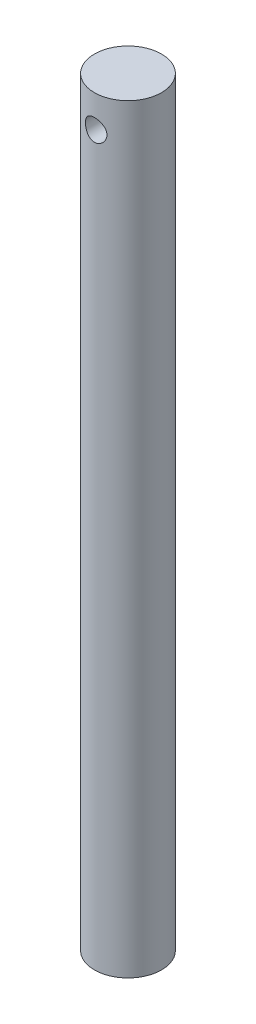
ISO-10303-21;
HEADER;
FILE_DESCRIPTION(('STEP AP214'),'2;1');
FILE_NAME('part.step','',(''),(''),'','','');
FILE_SCHEMA(('AUTOMOTIVE_DESIGN { 1 0 10303 214 1 1 1 1 }'));
ENDSEC;
DATA;
#1=APPLICATION_CONTEXT('core data for automotive mechanical design processes');
#2=APPLICATION_PROTOCOL_DEFINITION('international standard','automotive_design',2000,#1);
#3=PRODUCT_CONTEXT('',#1,'mechanical');
#4=PRODUCT('Part','Part','',(#3));
#5=PRODUCT_RELATED_PRODUCT_CATEGORY('part','',(#4));
#6=PRODUCT_DEFINITION_FORMATION('','',#4);
#7=PRODUCT_DEFINITION_CONTEXT('part definition',#1,'design');
#8=PRODUCT_DEFINITION('design','',#6,#7);
#9=PRODUCT_DEFINITION_SHAPE('','',#8);
#10=(LENGTH_UNIT() NAMED_UNIT(*) SI_UNIT(.MILLI.,.METRE.));
#11=(NAMED_UNIT(*) PLANE_ANGLE_UNIT() SI_UNIT($,.RADIAN.));
#12=(NAMED_UNIT(*) SI_UNIT($,.STERADIAN.) SOLID_ANGLE_UNIT());
#13=UNCERTAINTY_MEASURE_WITH_UNIT(LENGTH_MEASURE(1.E-05),#10,'distance_accuracy_value','');
#14=(GEOMETRIC_REPRESENTATION_CONTEXT(3) GLOBAL_UNCERTAINTY_ASSIGNED_CONTEXT((#13)) GLOBAL_UNIT_ASSIGNED_CONTEXT((#10,
#11,#12)) REPRESENTATION_CONTEXT('',''));
#15=CARTESIAN_POINT('',(0.,0.,0.));
#16=DIRECTION('',(0.,0.,1.));
#17=DIRECTION('',(1.,0.,0.));
#18=AXIS2_PLACEMENT_3D('',#15,#16,#17);
#19=CARTESIAN_POINT('',(20.574,290.957,19.939));
#20=DIRECTION('',(0.,-1.,0.));
#21=DIRECTION('',(0.,0.,1.));
#22=AXIS2_PLACEMENT_3D('',#19,#20,#21);
#23=CYLINDRICAL_SURFACE('',#22,9.906);
#24=CARTESIAN_POINT('',(20.574,284.607,29.845));
#25=CARTESIAN_POINT('',(20.4003900975091,284.606999562888,29.8449996061915));
#26=CARTESIAN_POINT('',(20.2267746019822,284.59271373406,29.8403933308697));
#27=CARTESIAN_POINT('',(19.8846347785665,284.536107084769,29.8224701738279));
#28=CARTESIAN_POINT('',(19.7161113704819,284.493781230604,29.8091517281183));
#29=CARTESIAN_POINT('',(19.3891383375286,284.382678440052,29.7752562456891));
#30=CARTESIAN_POINT('',(19.2306731118319,284.313943694529,29.7546907911152));
#31=CARTESIAN_POINT('',(18.9275180945867,284.152157998881,29.7084154733764));
#32=CARTESIAN_POINT('',(18.7828306929127,284.059102840629,29.6827047201083));
#33=CARTESIAN_POINT('',(18.5066631305322,283.848155524504,29.6279299838278));
#34=CARTESIAN_POINT('',(18.3756902580533,283.729619019658,29.5987901566408));
#35=CARTESIAN_POINT('',(18.1351014488948,283.472444978284,29.5408723692128));
#36=CARTESIAN_POINT('',(18.0254897541473,283.33380345879,29.5120944819057));
#37=CARTESIAN_POINT('',(17.8279296997844,283.035897265666,29.4573373522228));
#38=CARTESIAN_POINT('',(17.740624744777,282.876187150229,29.4314512803114));
#39=CARTESIAN_POINT('',(17.5943262770747,282.543387460439,29.3865541474673));
#40=CARTESIAN_POINT('',(17.535324864277,282.370301635202,29.3675411684781));
#41=CARTESIAN_POINT('',(17.449182282334,282.021405498296,29.3393382623613));
#42=CARTESIAN_POINT('',(17.4210964103846,281.845852582549,29.329857882216));
#43=CARTESIAN_POINT('',(17.3946299992803,281.49228999913,29.320932404975));
#44=CARTESIAN_POINT('',(17.3962410877471,281.314281038026,29.3214844794576));
#45=CARTESIAN_POINT('',(17.4283860255288,280.968763995361,29.3323058482074));
#46=CARTESIAN_POINT('',(17.4577071073125,280.801128149536,29.3421676684055));
#47=CARTESIAN_POINT('',(17.542468814693,280.473293570519,29.369833583895));
#48=CARTESIAN_POINT('',(17.5979123480243,280.31309566744,29.3876385633412));
#49=CARTESIAN_POINT('',(17.7341776934832,280.001846043877,29.4294885452327));
#50=CARTESIAN_POINT('',(17.8153721512621,279.850970183295,29.4536242115264));
#51=CARTESIAN_POINT('',(18.0005758026711,279.564592346352,29.5053758925019));
#52=CARTESIAN_POINT('',(18.1045911782425,279.429094550863,29.5329928493638));
#53=CARTESIAN_POINT('',(18.3383874139366,279.170478214256,29.5902181525973));
#54=CARTESIAN_POINT('',(18.4691658543698,279.048266850427,29.6198584357406));
#55=CARTESIAN_POINT('',(18.7497288111613,278.827283363236,29.6766243903546));
#56=CARTESIAN_POINT('',(18.8995148840282,278.728513161341,29.7037498555754));
#57=CARTESIAN_POINT('',(19.2156556946911,278.556557925074,29.7527406621395));
#58=CARTESIAN_POINT('',(19.3821413753952,278.483599313268,29.7745589522444));
#59=CARTESIAN_POINT('',(19.725886559119,278.366997824111,29.8101368137503));
#60=CARTESIAN_POINT('',(19.9031425937042,278.323345563073,29.8238989644894));
#61=CARTESIAN_POINT('',(20.2557042212796,278.26816452681,29.8413942383645));
#62=CARTESIAN_POINT('',(20.4307990071384,278.255408529173,29.8455102845543));
#63=CARTESIAN_POINT('',(20.7806516136552,278.25890848489,29.8443881106845));
#64=CARTESIAN_POINT('',(20.9554094822125,278.275159954378,29.8391513363491));
#65=CARTESIAN_POINT('',(21.2948266941627,278.33523341978,29.8201640449065));
#66=CARTESIAN_POINT('',(21.4596308313205,278.37831648951,29.8066418593152));
#67=CARTESIAN_POINT('',(21.7796180904854,278.489920177116,29.7726784506642));
#68=CARTESIAN_POINT('',(21.9348000044281,278.558443981545,29.7522363608874));
#69=CARTESIAN_POINT('',(22.2354812033595,278.72090432677,29.7058855888616));
#70=CARTESIAN_POINT('',(22.3806389165075,278.815436526499,29.6798523778661));
#71=CARTESIAN_POINT('',(22.6534378917215,279.026521354015,29.6252871712492));
#72=CARTESIAN_POINT('',(22.7810741539488,279.143080244778,29.5967544661731));
#73=CARTESIAN_POINT('',(23.0207530070436,279.400683190269,29.5389002188114));
#74=CARTESIAN_POINT('',(23.1319203126039,279.542547325863,29.5095955845007));
#75=CARTESIAN_POINT('',(23.3289606959753,279.843551670835,29.4547513522842));
#76=CARTESIAN_POINT('',(23.4148339678688,280.002691747642,29.4292117254902));
#77=CARTESIAN_POINT('',(23.5583599536811,280.333539233718,29.3850619207215));
#78=CARTESIAN_POINT('',(23.6161042500276,280.505203738166,29.3664293028914));
#79=CARTESIAN_POINT('',(23.7016398485219,280.856545356796,29.3384026591143));
#80=CARTESIAN_POINT('',(23.7294433230972,281.036219183829,29.3290048788844));
#81=CARTESIAN_POINT('',(23.7534046771126,281.389290263017,29.3209168710177));
#82=CARTESIAN_POINT('',(23.7510046935671,281.56257962913,29.3217386621516));
#83=CARTESIAN_POINT('',(23.7181343011121,281.906153212945,29.3328037727765));
#84=CARTESIAN_POINT('',(23.687665332273,282.07643758436,29.3430466089237));
#85=CARTESIAN_POINT('',(23.6005088319737,282.406441192232,29.3714500629734));
#86=CARTESIAN_POINT('',(23.5442544271075,282.566286966696,29.3894796065412));
#87=CARTESIAN_POINT('',(23.4074683392176,282.874397348048,29.4313857010331));
#88=CARTESIAN_POINT('',(23.3269315390082,283.022659505545,29.4552634841953));
#89=CARTESIAN_POINT('',(23.1400216552054,283.309954622222,29.5073924945417));
#90=CARTESIAN_POINT('',(23.0327274056325,283.448362996902,29.5357825500603));
#91=CARTESIAN_POINT('',(22.7969450135381,283.70567702225,29.5931209962115));
#92=CARTESIAN_POINT('',(22.6684510831818,283.824577329191,29.6220695374079));
#93=CARTESIAN_POINT('',(22.3885111653527,284.043675934385,29.6784786976015));
#94=CARTESIAN_POINT('',(22.2364194020823,284.143074282696,29.705851812889));
#95=CARTESIAN_POINT('',(21.9168117042693,284.314769298846,29.7548939099958));
#96=CARTESIAN_POINT('',(21.7493010735514,284.387075242929,29.776564843443));
#97=CARTESIAN_POINT('',(21.4156289154909,284.498108442957,29.8105062287362));
#98=CARTESIAN_POINT('',(21.2501828955443,284.538820324816,29.8233253822498));
#99=CARTESIAN_POINT('',(20.9144923067557,284.593263237149,29.8405715028082));
#100=CARTESIAN_POINT('',(20.7442488426637,284.60700042865,29.8450003861844));
#101=CARTESIAN_POINT('',(20.574,284.607,29.845));
#102=B_SPLINE_CURVE_WITH_KNOTS('',3,(#24,#25,#26,#27,#28,#29,#30,#31,#32,#33,#34,#35,#36,#37,
#38,#39,#40,#41,#42,#43,#44,#45,#46,#47,#48,#49,#50,#51,#52,#53,#54,#55,#56,#57,#58,#59,#60,#61,
#62,#63,#64,#65,#66,#67,#68,#69,#70,#71,#72,#73,#74,#75,#76,#77,#78,#79,#80,#81,#82,#83,#84,#85,
#86,#87,#88,#89,#90,#91,#92,#93,#94,#95,#96,#97,#98,#99,#100,#101),.UNSPECIFIED.,.T.,.F.,(4,2,2,
2,2,2,2,2,2,2,2,2,2,2,2,2,2,2,2,2,2,2,2,2,2,2,2,2,2,2,2,2,2,2,2,2,2,2,4),(0.,0.520203653190159,
1.04050071782689,1.55996998879536,2.07952920238256,2.61421803209669,3.14901293309813,
3.69783084299902,4.24649547723637,4.77788401275632,5.309122737732,5.81813774594538,
6.32720942687722,6.84401266954643,7.36095608188885,7.90272878350447,8.44454587879508,
8.99100443008418,9.53728792564177,10.0614885570786,10.5856081665447,11.0958958548675,
11.6062474803186,12.1294314627599,12.6527644295539,13.1979818527922,13.7431950924381,
14.2866211591328,14.8298262127012,15.3471971329632,15.8645415111503,16.373497501837,
16.8825608231595,17.4124232772658,17.9424306319825,18.4909828852277,19.0393471461224,
19.5495962947256,20.0597288887445),.UNSPECIFIED.);
#103=CARTESIAN_POINT('',(20.574,284.607,29.845));
#104=VERTEX_POINT('',#103);
#105=EDGE_CURVE('E37',#104,#104,#102,.T.);
#106=ORIENTED_EDGE('',*,*,#105,.F.);
#107=EDGE_LOOP('',(#106));
#108=FACE_BOUND('',#107,.T.);
#109=CARTESIAN_POINT('',(23.749,281.432,10.5555991772705));
#110=CARTESIAN_POINT('',(23.7489995390351,281.258648845424,10.555598669891));
#111=CARTESIAN_POINT('',(23.73475472324,281.085292093388,10.5507428403606));
#112=CARTESIAN_POINT('',(23.6783257570464,280.743687818861,10.531935652275));
#113=CARTESIAN_POINT('',(23.6361351975167,280.575441477662,10.5179822072666));
#114=CARTESIAN_POINT('',(23.5254275060581,280.24905768367,10.4827190522964));
#115=CARTESIAN_POINT('',(23.456958833973,280.090902244538,10.461422890448));
#116=CARTESIAN_POINT('',(23.2958016799056,279.78827622172,10.4138929944622));
#117=CARTESIAN_POINT('',(23.2031085050567,279.643808297031,10.3876583038893));
#118=CARTESIAN_POINT('',(22.9925447882256,279.367435871302,10.3321436934421));
#119=CARTESIAN_POINT('',(22.8739482742391,279.236098733427,10.3027921228796));
#120=CARTESIAN_POINT('',(22.616496293565,278.99479483814,10.2449590642021));
#121=CARTESIAN_POINT('',(22.4776378477726,278.884831228824,10.21647770478));
#122=CARTESIAN_POINT('',(22.1794994338713,278.686865608948,10.162770781909));
#123=CARTESIAN_POINT('',(22.0198104845676,278.599451735604,10.1376393759217));
#124=CARTESIAN_POINT('',(21.687053441495,278.452946469813,10.094303527544));
#125=CARTESIAN_POINT('',(21.5139886778021,278.393848054089,10.0760973676682));
#126=CARTESIAN_POINT('',(21.1653363559693,278.307556830947,10.0491706408477));
#127=CARTESIAN_POINT('',(20.9900116534782,278.279393464855,10.0401621911904));
#128=CARTESIAN_POINT('',(20.6369093181982,278.252692550356,10.0316271990831));
#129=CARTESIAN_POINT('',(20.4591322812483,278.254147927961,10.0320983925639));
#130=CARTESIAN_POINT('',(20.113017246645,278.286013338169,10.0422711662201));
#131=CARTESIAN_POINT('',(19.9445708572342,278.315370479982,10.0516370882707));
#132=CARTESIAN_POINT('',(19.6151357663183,278.40047336135,10.0781308856556));
#133=CARTESIAN_POINT('',(19.4541475599441,278.456220850147,10.0952592755098));
#134=CARTESIAN_POINT('',(19.1418175974258,278.593174871574,10.1357952456068));
#135=CARTESIAN_POINT('',(18.9906229499398,278.674693346282,10.1592792264352));
#136=CARTESIAN_POINT('',(18.7037374951982,278.860622591593,10.2100632635124));
#137=CARTESIAN_POINT('',(18.5680507753764,278.965039376449,10.2373643216344));
#138=CARTESIAN_POINT('',(18.3097596090472,279.199169584741,10.2942960196121));
#139=CARTESIAN_POINT('',(18.1879866322157,279.329789491973,10.3239763241294));
#140=CARTESIAN_POINT('',(17.967818041401,279.609865234723,10.3813000865392));
#141=CARTESIAN_POINT('',(17.8694254872229,279.759323531717,10.4089432775078));
#142=CARTESIAN_POINT('',(17.6977751670265,280.075289872861,10.4593217241486));
#143=CARTESIAN_POINT('',(17.6248414173911,280.241985004097,10.4819924356187));
#144=CARTESIAN_POINT('',(17.5083486253,280.586195456073,10.51910619941));
#145=CARTESIAN_POINT('',(17.4647783736975,280.763706619679,10.5335523910111));
#146=CARTESIAN_POINT('',(17.4098868374428,281.116510345579,10.5518795117724));
#147=CARTESIAN_POINT('',(17.3972862425618,281.291582198877,10.5561792587354));
#148=CARTESIAN_POINT('',(17.4010879812931,281.641356226441,10.5548924763253));
#149=CARTESIAN_POINT('',(17.4174855442112,281.816058456783,10.5493075731465));
#150=CARTESIAN_POINT('',(17.4776723805921,282.154510097642,10.5292958124389));
#151=CARTESIAN_POINT('',(17.5205988996103,282.318431146569,10.5151477282929));
#152=CARTESIAN_POINT('',(17.6316037877074,282.636720351873,10.4799033861806));
#153=CARTESIAN_POINT('',(17.699686397315,282.791086892536,10.4588059568377));
#154=CARTESIAN_POINT('',(17.8613868420137,283.090987774903,10.4112589135614));
#155=CARTESIAN_POINT('',(17.9557063087524,283.236120873992,10.3846683221826));
#156=CARTESIAN_POINT('',(18.1663931271625,283.508964480416,10.3294159111981));
#157=CARTESIAN_POINT('',(18.2827665005126,283.6366702129,10.3007535272279));
#158=CARTESIAN_POINT('',(18.5403356898319,283.876826024731,10.2430634746458));
#159=CARTESIAN_POINT('',(18.6823974333562,283.988359361769,10.2140750819163));
#160=CARTESIAN_POINT('',(18.983926894148,284.186048768724,10.160251455954));
#161=CARTESIAN_POINT('',(19.1433938720024,284.272205916104,10.1354160464065));
#162=CARTESIAN_POINT('',(19.4742872951391,284.415881003148,10.0928299482725));
#163=CARTESIAN_POINT('',(19.6456198316103,284.473599782449,10.075029757226));
#164=CARTESIAN_POINT('',(19.9962357645985,284.559194998656,10.0483031214846));
#165=CARTESIAN_POINT('',(20.1755165096599,284.587081310562,10.0393737404864));
#166=CARTESIAN_POINT('',(20.5285218035825,284.611384680092,10.0315996727426));
#167=CARTESIAN_POINT('',(20.7021471265461,284.609122716187,10.0323316492719));
#168=CARTESIAN_POINT('',(21.0464304731927,284.576412425482,10.0427733465139));
#169=CARTESIAN_POINT('',(21.2170887068393,284.545966101465,10.0524824293127));
#170=CARTESIAN_POINT('',(21.5482771224043,284.458606592941,10.0796451876183));
#171=CARTESIAN_POINT('',(21.7089142466594,284.40206281633,10.0969906178987));
#172=CARTESIAN_POINT('',(22.0184936404195,284.264449997697,10.1376390255194));
#173=CARTESIAN_POINT('',(22.1674338514434,284.183376650968,10.1609430484251));
#174=CARTESIAN_POINT('',(22.4550862541752,283.995719324097,10.2121067939125));
#175=CARTESIAN_POINT('',(22.593255678412,283.888339546976,10.2400977486107));
#176=CARTESIAN_POINT('',(22.8500503306485,283.652501940289,10.2971243376308));
#177=CARTESIAN_POINT('',(22.9686695418159,283.524037645875,10.326160290227));
#178=CARTESIAN_POINT('',(23.18724313995,283.244235401769,10.3832150406216));
#179=CARTESIAN_POINT('',(23.2863888018085,283.092249046372,10.4111615192087));
#180=CARTESIAN_POINT('',(23.457635920857,282.772918613244,10.4615799632596));
#181=CARTESIAN_POINT('',(23.5297468969277,282.605579966917,10.4840538546361));
#182=CARTESIAN_POINT('',(23.6404443589439,282.2723403432,10.5193978814111));
#183=CARTESIAN_POINT('',(23.6810280300338,282.107162274879,10.5328312089641));
#184=CARTESIAN_POINT('',(23.7353023016782,281.771990355,10.5509308750857));
#185=CARTESIAN_POINT('',(23.7490004520481,281.601997869,10.5555996748354));
#186=CARTESIAN_POINT('',(23.749,281.432,10.5555991772705));
#187=B_SPLINE_CURVE_WITH_KNOTS('',3,(#109,#110,#111,#112,#113,#114,#115,#116,#117,#118,#119,
#120,#121,#122,#123,#124,#125,#126,#127,#128,#129,#130,#131,#132,#133,#134,#135,#136,#137,#138,
#139,#140,#141,#142,#143,#144,#145,#146,#147,#148,#149,#150,#151,#152,#153,#154,#155,#156,#157,
#158,#159,#160,#161,#162,#163,#164,#165,#166,#167,#168,#169,#170,#171,#172,#173,#174,#175,#176,
#177,#178,#179,#180,#181,#182,#183,#184,#185,#186),.UNSPECIFIED.,.T.,.F.,(4,2,2,2,2,2,2,2,2,2,2,
2,2,2,2,2,2,2,2,2,2,2,2,2,2,2,2,2,2,2,2,2,2,2,2,2,2,2,4),(0.,0.519424913269979,1.03896899372477,
1.55755954366802,2.07625063159032,2.61195145698113,3.14773112578966,3.69632464246908,
4.24478201718657,4.77549171645943,5.30607466525917,5.81739893053468,6.32875709290453,
6.84655855087936,7.36449617288678,7.90508126396085,8.4457370627056,8.99304239171278,
9.54013867525679,10.0642241589064,10.5882234295295,11.0960183198062,11.6038988474713,
12.1269412246057,12.6501266214326,13.1962977107937,13.742445606616,14.2846791015578,
14.8267330533656,15.3451174273333,15.863464967704,16.3746903114133,16.8860054224304,
17.4152743224352,17.94470580888,18.4928662860357,19.0408335748635,19.5503538906459,
20.0597311057995),.UNSPECIFIED.);
#188=CARTESIAN_POINT('',(23.749,281.432,10.5555991772705));
#189=VERTEX_POINT('',#188);
#190=EDGE_CURVE('E49',#189,#189,#187,.T.);
#191=ORIENTED_EDGE('',*,*,#190,.F.);
#192=EDGE_LOOP('',(#191));
#193=FACE_BOUND('',#192,.T.);
#194=CARTESIAN_POINT('',(20.574,290.957,19.939));
#195=DIRECTION('',(0.,-1.,0.));
#196=DIRECTION('',(0.,0.,-1.));
#197=AXIS2_PLACEMENT_3D('',#194,#195,#196);
#198=CIRCLE('',#197,9.906);
#199=CARTESIAN_POINT('',(20.574,290.957,10.033));
#200=VERTEX_POINT('',#199);
#201=EDGE_CURVE('E10',#200,#200,#198,.T.);
#202=ORIENTED_EDGE('',*,*,#201,.T.);
#203=EDGE_LOOP('',(#202));
#204=FACE_BOUND('',#203,.T.);
#205=CARTESIAN_POINT('',(20.574,66.4210000000001,19.939));
#206=DIRECTION('',(0.,1.,0.));
#207=DIRECTION('',(0.,0.,1.));
#208=AXIS2_PLACEMENT_3D('',#205,#206,#207);
#209=CIRCLE('',#208,9.90600000000001);
#210=CARTESIAN_POINT('',(20.574,66.4210000000001,29.845));
#211=VERTEX_POINT('',#210);
#212=EDGE_CURVE('E51',#211,#211,#209,.T.);
#213=ORIENTED_EDGE('',*,*,#212,.T.);
#214=EDGE_LOOP('',(#213));
#215=FACE_BOUND('',#214,.T.);
#216=ADVANCED_FACE('F33',(#108,#193,#204,#215),#23,.T.);
#217=CARTESIAN_POINT('',(20.574,290.957,19.939));
#218=DIRECTION('',(0.,1.,0.));
#219=DIRECTION('',(0.,0.,-1.));
#220=AXIS2_PLACEMENT_3D('',#217,#218,#219);
#221=PLANE('',#220);
#222=ORIENTED_EDGE('',*,*,#201,.F.);
#223=EDGE_LOOP('',(#222));
#224=FACE_BOUND('',#223,.T.);
#225=ADVANCED_FACE('F61',(#224),#221,.T.);
#226=CARTESIAN_POINT('',(20.574,281.432,60.687154312765));
#227=DIRECTION('',(0.,0.,-1.));
#228=DIRECTION('',(1.,0.,0.));
#229=AXIS2_PLACEMENT_3D('',#226,#227,#228);
#230=CYLINDRICAL_SURFACE('',#229,3.175);
#231=ORIENTED_EDGE('',*,*,#190,.T.);
#232=EDGE_LOOP('',(#231));
#233=FACE_BOUND('',#232,.T.);
#234=ORIENTED_EDGE('',*,*,#105,.T.);
#235=EDGE_LOOP('',(#234));
#236=FACE_BOUND('',#235,.T.);
#237=ADVANCED_FACE('F56',(#233,#236),#230,.F.);
#238=CARTESIAN_POINT('',(20.574,66.4210000000001,19.939));
#239=DIRECTION('',(0.,-1.,0.));
#240=DIRECTION('',(0.,0.,1.));
#241=AXIS2_PLACEMENT_3D('',#238,#239,#240);
#242=PLANE('',#241);
#243=ORIENTED_EDGE('',*,*,#212,.F.);
#244=EDGE_LOOP('',(#243));
#245=FACE_BOUND('',#244,.T.);
#246=ADVANCED_FACE('F60',(#245),#242,.T.);
#247=CLOSED_SHELL('',(#216,#225,#237,#246));
#248=MANIFOLD_SOLID_BREP('B2',#247);
#249=ADVANCED_BREP_SHAPE_REPRESENTATION('',(#18,#248),#14);
#250=SHAPE_DEFINITION_REPRESENTATION(#9,#249);
ENDSEC;
END-ISO-10303-21;
